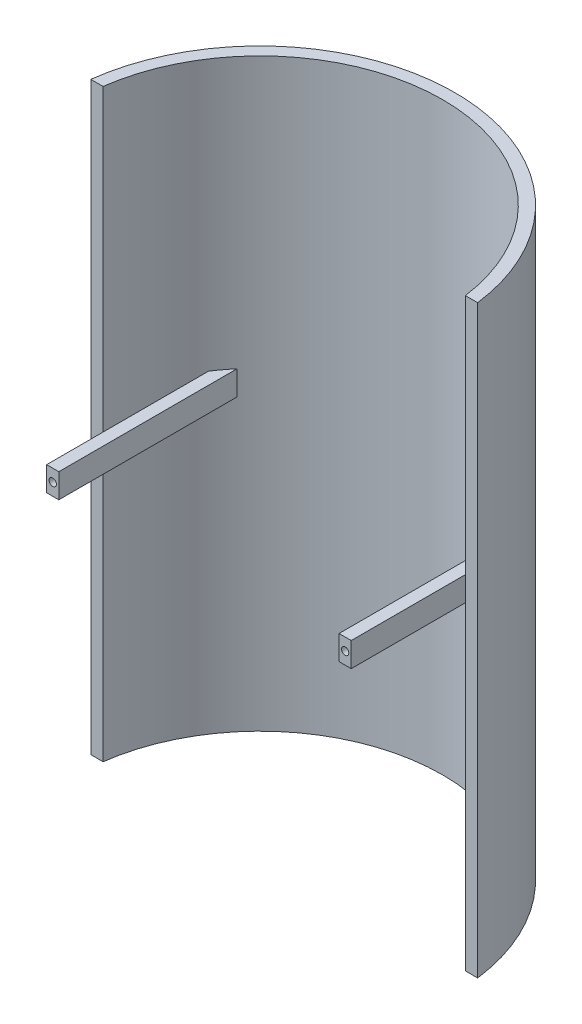
ISO-10303-21;
HEADER;
FILE_DESCRIPTION(('STEP AP214'),'2;1');
FILE_NAME('part.step','',(''),(''),'','','');
FILE_SCHEMA(('AUTOMOTIVE_DESIGN { 1 0 10303 214 1 1 1 1 }'));
ENDSEC;
DATA;
#1=APPLICATION_CONTEXT('core data for automotive mechanical design processes');
#2=APPLICATION_PROTOCOL_DEFINITION('international standard','automotive_design',2000,#1);
#3=PRODUCT_CONTEXT('',#1,'mechanical');
#4=PRODUCT('Part','Part','',(#3));
#5=PRODUCT_RELATED_PRODUCT_CATEGORY('part','',(#4));
#6=PRODUCT_DEFINITION_FORMATION('','',#4);
#7=PRODUCT_DEFINITION_CONTEXT('part definition',#1,'design');
#8=PRODUCT_DEFINITION('design','',#6,#7);
#9=PRODUCT_DEFINITION_SHAPE('','',#8);
#10=(LENGTH_UNIT() NAMED_UNIT(*) SI_UNIT(.MILLI.,.METRE.));
#11=(NAMED_UNIT(*) PLANE_ANGLE_UNIT() SI_UNIT($,.RADIAN.));
#12=(NAMED_UNIT(*) SI_UNIT($,.STERADIAN.) SOLID_ANGLE_UNIT());
#13=UNCERTAINTY_MEASURE_WITH_UNIT(LENGTH_MEASURE(1.E-05),#10,'distance_accuracy_value','');
#14=(GEOMETRIC_REPRESENTATION_CONTEXT(3) GLOBAL_UNCERTAINTY_ASSIGNED_CONTEXT((#13)) GLOBAL_UNIT_ASSIGNED_CONTEXT((#10,
#11,#12)) REPRESENTATION_CONTEXT('',''));
#15=CARTESIAN_POINT('',(0.,0.,0.));
#16=DIRECTION('',(0.,0.,1.));
#17=DIRECTION('',(1.,0.,0.));
#18=AXIS2_PLACEMENT_3D('',#15,#16,#17);
#19=CARTESIAN_POINT('',(-80.,-120.,70.));
#20=DIRECTION('',(0.,1.,0.));
#21=DIRECTION('',(0.,0.,1.));
#22=AXIS2_PLACEMENT_3D('',#19,#20,#21);
#23=PLANE('',#22);
#24=CARTESIAN_POINT('',(0.,-120.,80.));
#25=DIRECTION('',(0.,1.,0.));
#26=DIRECTION('',(0.,0.,1.));
#27=AXIS2_PLACEMENT_3D('',#24,#25,#26);
#28=CIRCLE('',#27,80.);
#29=CARTESIAN_POINT('',(79.3725393319377,-120.,70.));
#30=VERTEX_POINT('',#29);
#31=CARTESIAN_POINT('',(-79.3725393319377,-120.,70.));
#32=VERTEX_POINT('',#31);
#33=EDGE_CURVE('E279',#30,#32,#28,.T.);
#34=ORIENTED_EDGE('',*,*,#33,.F.);
#35=DIRECTION('',(1.,0.,0.));
#36=VECTOR('',#35,1.);
#37=CARTESIAN_POINT('',(-80.,-120.,70.));
#38=LINE('',#37,#36);
#39=CARTESIAN_POINT('',(74.3303437365925,-120.,70.));
#40=VERTEX_POINT('',#39);
#41=EDGE_CURVE('E282',#40,#30,#38,.T.);
#42=ORIENTED_EDGE('',*,*,#41,.F.);
#43=CARTESIAN_POINT('',(0.,-120.,80.));
#44=DIRECTION('',(0.,1.,0.));
#45=DIRECTION('',(0.,0.,1.));
#46=AXIS2_PLACEMENT_3D('',#43,#44,#45);
#47=CIRCLE('',#46,75.);
#48=CARTESIAN_POINT('',(-74.3303437365926,-120.,70.));
#49=VERTEX_POINT('',#48);
#50=EDGE_CURVE('E267',#40,#49,#47,.T.);
#51=ORIENTED_EDGE('',*,*,#50,.T.);
#52=EDGE_CURVE('E283',#32,#49,#38,.T.);
#53=ORIENTED_EDGE('',*,*,#52,.F.);
#54=EDGE_LOOP('',(#34,#42,#51,#53));
#55=FACE_BOUND('',#54,.T.);
#56=ADVANCED_FACE('F99',(#55),#23,.F.);
#57=CARTESIAN_POINT('',(-80.,120.,70.));
#58=DIRECTION('',(0.,-1.,0.));
#59=DIRECTION('',(1.,0.,0.));
#60=AXIS2_PLACEMENT_3D('',#57,#58,#59);
#61=PLANE('',#60);
#62=DIRECTION('',(-1.,0.,0.));
#63=VECTOR('',#62,1.);
#64=CARTESIAN_POINT('',(-80.,120.,70.));
#65=LINE('',#64,#63);
#66=CARTESIAN_POINT('',(79.3725393319377,120.,70.));
#67=VERTEX_POINT('',#66);
#68=CARTESIAN_POINT('',(74.3303437365925,120.,70.));
#69=VERTEX_POINT('',#68);
#70=EDGE_CURVE('E290',#67,#69,#65,.T.);
#71=ORIENTED_EDGE('',*,*,#70,.F.);
#72=CARTESIAN_POINT('',(0.,120.,80.));
#73=DIRECTION('',(0.,1.,0.));
#74=DIRECTION('',(0.,0.,1.));
#75=AXIS2_PLACEMENT_3D('',#72,#73,#74);
#76=CIRCLE('',#75,80.);
#77=CARTESIAN_POINT('',(-79.3725393319377,120.,70.));
#78=VERTEX_POINT('',#77);
#79=EDGE_CURVE('E271',#67,#78,#76,.T.);
#80=ORIENTED_EDGE('',*,*,#79,.T.);
#81=CARTESIAN_POINT('',(-74.3303437365926,120.,70.));
#82=VERTEX_POINT('',#81);
#83=EDGE_CURVE('E287',#82,#78,#65,.T.);
#84=ORIENTED_EDGE('',*,*,#83,.F.);
#85=CARTESIAN_POINT('',(0.,120.,80.));
#86=DIRECTION('',(0.,1.,0.));
#87=DIRECTION('',(0.,0.,1.));
#88=AXIS2_PLACEMENT_3D('',#85,#86,#87);
#89=CIRCLE('',#88,75.);
#90=EDGE_CURVE('E264',#69,#82,#89,.T.);
#91=ORIENTED_EDGE('',*,*,#90,.F.);
#92=EDGE_LOOP('',(#71,#80,#84,#91));
#93=FACE_BOUND('',#92,.T.);
#94=ADVANCED_FACE('F336',(#93),#61,.F.);
#95=CARTESIAN_POINT('',(-80.,-110.,70.));
#96=DIRECTION('',(0.,0.,1.));
#97=DIRECTION('',(1.,0.,0.));
#98=AXIS2_PLACEMENT_3D('',#95,#96,#97);
#99=PLANE('',#98);
#100=ORIENTED_EDGE('',*,*,#41,.T.);
#101=DIRECTION('',(0.,1.,0.));
#102=VECTOR('',#101,1.);
#103=CARTESIAN_POINT('',(79.3725393319377,-122.,70.));
#104=LINE('',#103,#102);
#105=EDGE_CURVE('E260',#30,#67,#104,.T.);
#106=ORIENTED_EDGE('',*,*,#105,.T.);
#107=ORIENTED_EDGE('',*,*,#70,.T.);
#108=DIRECTION('',(0.,1.,0.));
#109=VECTOR('',#108,1.);
#110=CARTESIAN_POINT('',(74.3303437365926,-122.,70.));
#111=LINE('',#110,#109);
#112=EDGE_CURVE('E294',#40,#69,#111,.T.);
#113=ORIENTED_EDGE('',*,*,#112,.F.);
#114=EDGE_LOOP('',(#100,#106,#107,#113));
#115=FACE_BOUND('',#114,.T.);
#116=ADVANCED_FACE('F326',(#115),#99,.T.);
#117=DIRECTION('',(0.,1.,0.));
#118=VECTOR('',#117,1.);
#119=CARTESIAN_POINT('',(-74.3303437365926,-122.,70.));
#120=LINE('',#119,#118);
#121=EDGE_CURVE('E291',#82,#49,#120,.F.);
#122=ORIENTED_EDGE('',*,*,#121,.F.);
#123=ORIENTED_EDGE('',*,*,#83,.T.);
#124=DIRECTION('',(0.,1.,0.));
#125=VECTOR('',#124,1.);
#126=CARTESIAN_POINT('',(-79.3725393319377,-122.,70.));
#127=LINE('',#126,#125);
#128=EDGE_CURVE('E275',#32,#78,#127,.T.);
#129=ORIENTED_EDGE('',*,*,#128,.F.);
#130=ORIENTED_EDGE('',*,*,#52,.T.);
#131=EDGE_LOOP('',(#122,#123,#129,#130));
#132=FACE_BOUND('',#131,.T.);
#133=ADVANCED_FACE('F342',(#132),#99,.T.);
#134=CARTESIAN_POINT('',(0.,-122.,80.));
#135=DIRECTION('',(0.,1.,0.));
#136=DIRECTION('',(0.,0.,1.));
#137=AXIS2_PLACEMENT_3D('',#134,#135,#136);
#138=CYLINDRICAL_SURFACE('',#137,80.);
#139=ORIENTED_EDGE('',*,*,#33,.T.);
#140=ORIENTED_EDGE('',*,*,#128,.T.);
#141=ORIENTED_EDGE('',*,*,#79,.F.);
#142=ORIENTED_EDGE('',*,*,#105,.F.);
#143=EDGE_LOOP('',(#139,#140,#141,#142));
#144=FACE_BOUND('',#143,.T.);
#145=ADVANCED_FACE('F333',(#144),#138,.T.);
#146=CARTESIAN_POINT('',(0.,-122.,80.));
#147=DIRECTION('',(0.,1.,0.));
#148=DIRECTION('',(0.,0.,1.));
#149=AXIS2_PLACEMENT_3D('',#146,#147,#148);
#150=CYLINDRICAL_SURFACE('',#149,75.);
#151=CARTESIAN_POINT('',(0.,-1.00000000000004,80.));
#152=DIRECTION('',(0.,-1.,0.));
#153=DIRECTION('',(0.,0.,-1.));
#154=AXIS2_PLACEMENT_3D('',#151,#152,#153);
#155=CIRCLE('',#154,75.);
#156=CARTESIAN_POINT('',(62.5,-1.00000000000004,38.5421901205575));
#157=VERTEX_POINT('',#156);
#158=CARTESIAN_POINT('',(57.5,-1.00000000000004,31.8465992893544));
#159=VERTEX_POINT('',#158);
#160=EDGE_CURVE('E107',#157,#159,#155,.F.);
#161=ORIENTED_EDGE('',*,*,#160,.T.);
#162=DIRECTION('',(0.,1.,0.));
#163=VECTOR('',#162,1.);
#164=CARTESIAN_POINT('',(57.5,-122.,31.8465992893544));
#165=LINE('',#164,#163);
#166=CARTESIAN_POINT('',(57.5,8.99999999999999,31.8465992893544));
#167=VERTEX_POINT('',#166);
#168=EDGE_CURVE('E12',#159,#167,#165,.T.);
#169=ORIENTED_EDGE('',*,*,#168,.T.);
#170=CARTESIAN_POINT('',(0.,8.99999999999998,80.));
#171=DIRECTION('',(0.,1.,0.));
#172=DIRECTION('',(0.,0.,1.));
#173=AXIS2_PLACEMENT_3D('',#170,#171,#172);
#174=CIRCLE('',#173,75.);
#175=CARTESIAN_POINT('',(62.5,8.99999999999996,38.5421901205575));
#176=VERTEX_POINT('',#175);
#177=EDGE_CURVE('E316',#167,#176,#174,.F.);
#178=ORIENTED_EDGE('',*,*,#177,.T.);
#179=DIRECTION('',(0.,1.,0.));
#180=VECTOR('',#179,1.);
#181=CARTESIAN_POINT('',(62.5,-122.,38.5421901205575));
#182=LINE('',#181,#180);
#183=EDGE_CURVE('E312',#157,#176,#182,.T.);
#184=ORIENTED_EDGE('',*,*,#183,.F.);
#185=EDGE_LOOP('',(#161,#169,#178,#184));
#186=FACE_BOUND('',#185,.T.);
#187=CARTESIAN_POINT('',(0.,8.99999999999998,80.));
#188=DIRECTION('',(0.,-1.,0.));
#189=DIRECTION('',(0.,0.,-1.));
#190=AXIS2_PLACEMENT_3D('',#187,#188,#189);
#191=CIRCLE('',#190,75.);
#192=CARTESIAN_POINT('',(-57.5,8.99999999999999,31.8465992893544));
#193=VERTEX_POINT('',#192);
#194=CARTESIAN_POINT('',(-62.5,8.99999999999995,38.5421901205574));
#195=VERTEX_POINT('',#194);
#196=EDGE_CURVE('E305',#193,#195,#191,.F.);
#197=ORIENTED_EDGE('',*,*,#196,.F.);
#198=DIRECTION('',(0.,1.,0.));
#199=VECTOR('',#198,1.);
#200=CARTESIAN_POINT('',(-57.5,-122.,31.8465992893544));
#201=LINE('',#200,#199);
#202=CARTESIAN_POINT('',(-57.5,-1.00000000000004,31.8465992893544));
#203=VERTEX_POINT('',#202);
#204=EDGE_CURVE('E309',#193,#203,#201,.F.);
#205=ORIENTED_EDGE('',*,*,#204,.T.);
#206=CARTESIAN_POINT('',(0.,-1.00000000000004,80.));
#207=DIRECTION('',(0.,1.,0.));
#208=DIRECTION('',(0.,0.,1.));
#209=AXIS2_PLACEMENT_3D('',#206,#207,#208);
#210=CIRCLE('',#209,75.);
#211=CARTESIAN_POINT('',(-62.5,-1.00000000000005,38.5421901205574));
#212=VERTEX_POINT('',#211);
#213=EDGE_CURVE('E301',#212,#203,#210,.F.);
#214=ORIENTED_EDGE('',*,*,#213,.F.);
#215=DIRECTION('',(0.,1.,0.));
#216=VECTOR('',#215,1.);
#217=CARTESIAN_POINT('',(-62.5,-122.,38.5421901205574));
#218=LINE('',#217,#216);
#219=EDGE_CURVE('E297',#195,#212,#218,.F.);
#220=ORIENTED_EDGE('',*,*,#219,.F.);
#221=EDGE_LOOP('',(#197,#205,#214,#220));
#222=FACE_BOUND('',#221,.T.);
#223=ORIENTED_EDGE('',*,*,#112,.T.);
#224=ORIENTED_EDGE('',*,*,#90,.T.);
#225=ORIENTED_EDGE('',*,*,#121,.T.);
#226=ORIENTED_EDGE('',*,*,#50,.F.);
#227=EDGE_LOOP('',(#223,#224,#225,#226));
#228=FACE_BOUND('',#227,.T.);
#229=ADVANCED_FACE('F340',(#186,#222,#228),#150,.F.);
#230=CARTESIAN_POINT('',(-57.5,8.99999999999995,105.));
#231=DIRECTION('',(0.,0.,-1.));
#232=DIRECTION('',(-1.,0.,0.));
#233=AXIS2_PLACEMENT_3D('',#230,#231,#232);
#234=PLANE('',#233);
#235=CARTESIAN_POINT('',(-60.,3.99999999999996,105.));
#236=DIRECTION('',(0.,0.,1.));
#237=DIRECTION('',(1.,0.,0.));
#238=AXIS2_PLACEMENT_3D('',#235,#236,#237);
#239=CIRCLE('',#238,1.5);
#240=CARTESIAN_POINT('',(-58.5,3.99999999999996,105.));
#241=VERTEX_POINT('',#240);
#242=EDGE_CURVE('E194',#241,#241,#239,.T.);
#243=ORIENTED_EDGE('',*,*,#242,.F.);
#244=EDGE_LOOP('',(#243));
#245=FACE_BOUND('',#244,.T.);
#246=DIRECTION('',(0.,-1.,0.));
#247=VECTOR('',#246,1.);
#248=CARTESIAN_POINT('',(-62.5,8.99999999999995,105.));
#249=LINE('',#248,#247);
#250=CARTESIAN_POINT('',(-62.5,8.99999999999995,105.));
#251=VERTEX_POINT('',#250);
#252=CARTESIAN_POINT('',(-62.5,-1.00000000000005,105.));
#253=VERTEX_POINT('',#252);
#254=EDGE_CURVE('E247',#251,#253,#249,.T.);
#255=ORIENTED_EDGE('',*,*,#254,.T.);
#256=DIRECTION('',(-1.,0.,0.));
#257=VECTOR('',#256,1.);
#258=CARTESIAN_POINT('',(-57.5,-1.00000000000005,105.));
#259=LINE('',#258,#257);
#260=CARTESIAN_POINT('',(-57.5,-1.00000000000005,105.));
#261=VERTEX_POINT('',#260);
#262=EDGE_CURVE('E244',#261,#253,#259,.T.);
#263=ORIENTED_EDGE('',*,*,#262,.F.);
#264=DIRECTION('',(0.,-1.,0.));
#265=VECTOR('',#264,1.);
#266=CARTESIAN_POINT('',(-57.5,8.99999999999995,105.));
#267=LINE('',#266,#265);
#268=CARTESIAN_POINT('',(-57.5,8.99999999999995,105.));
#269=VERTEX_POINT('',#268);
#270=EDGE_CURVE('E236',#269,#261,#267,.T.);
#271=ORIENTED_EDGE('',*,*,#270,.F.);
#272=DIRECTION('',(-1.,0.,0.));
#273=VECTOR('',#272,1.);
#274=CARTESIAN_POINT('',(-57.5,8.99999999999995,105.));
#275=LINE('',#274,#273);
#276=EDGE_CURVE('E256',#269,#251,#275,.T.);
#277=ORIENTED_EDGE('',*,*,#276,.T.);
#278=EDGE_LOOP('',(#255,#263,#271,#277));
#279=FACE_BOUND('',#278,.T.);
#280=ADVANCED_FACE('F375',(#245,#279),#234,.F.);
#281=CARTESIAN_POINT('',(-57.5,0.,0.));
#282=DIRECTION('',(1.,0.,0.));
#283=DIRECTION('',(0.,0.,-1.));
#284=AXIS2_PLACEMENT_3D('',#281,#282,#283);
#285=PLANE('',#284);
#286=ORIENTED_EDGE('',*,*,#204,.F.);
#287=DIRECTION('',(0.,0.,1.));
#288=VECTOR('',#287,1.);
#289=CARTESIAN_POINT('',(-57.5,8.99999999999997,5.));
#290=LINE('',#289,#288);
#291=EDGE_CURVE('E233',#193,#269,#290,.T.);
#292=ORIENTED_EDGE('',*,*,#291,.T.);
#293=ORIENTED_EDGE('',*,*,#270,.T.);
#294=DIRECTION('',(0.,0.,-1.));
#295=VECTOR('',#294,1.);
#296=CARTESIAN_POINT('',(-57.5,-1.00000000000005,105.));
#297=LINE('',#296,#295);
#298=EDGE_CURVE('E240',#261,#203,#297,.T.);
#299=ORIENTED_EDGE('',*,*,#298,.T.);
#300=EDGE_LOOP('',(#286,#292,#293,#299));
#301=FACE_BOUND('',#300,.T.);
#302=ADVANCED_FACE('F369',(#301),#285,.T.);
#303=CARTESIAN_POINT('',(-62.5,0.,0.));
#304=DIRECTION('',(1.,0.,0.));
#305=DIRECTION('',(0.,0.,-1.));
#306=AXIS2_PLACEMENT_3D('',#303,#304,#305);
#307=PLANE('',#306);
#308=DIRECTION('',(0.,0.,1.));
#309=VECTOR('',#308,1.);
#310=CARTESIAN_POINT('',(-62.5,8.99999999999997,5.));
#311=LINE('',#310,#309);
#312=EDGE_CURVE('E229',#195,#251,#311,.T.);
#313=ORIENTED_EDGE('',*,*,#312,.F.);
#314=ORIENTED_EDGE('',*,*,#219,.T.);
#315=DIRECTION('',(0.,0.,-1.));
#316=VECTOR('',#315,1.);
#317=CARTESIAN_POINT('',(-62.5,-1.00000000000005,105.));
#318=LINE('',#317,#316);
#319=EDGE_CURVE('E237',#253,#212,#318,.T.);
#320=ORIENTED_EDGE('',*,*,#319,.F.);
#321=ORIENTED_EDGE('',*,*,#254,.F.);
#322=EDGE_LOOP('',(#313,#314,#320,#321));
#323=FACE_BOUND('',#322,.T.);
#324=ADVANCED_FACE('F374',(#323),#307,.F.);
#325=CARTESIAN_POINT('',(-57.5,-1.00000000000005,105.));
#326=DIRECTION('',(0.,1.,0.));
#327=DIRECTION('',(0.,0.,1.));
#328=AXIS2_PLACEMENT_3D('',#325,#326,#327);
#329=PLANE('',#328);
#330=ORIENTED_EDGE('',*,*,#319,.T.);
#331=ORIENTED_EDGE('',*,*,#213,.T.);
#332=ORIENTED_EDGE('',*,*,#298,.F.);
#333=ORIENTED_EDGE('',*,*,#262,.T.);
#334=EDGE_LOOP('',(#330,#331,#332,#333));
#335=FACE_BOUND('',#334,.T.);
#336=ADVANCED_FACE('F387',(#335),#329,.F.);
#337=CARTESIAN_POINT('',(-57.5,8.99999999999997,5.));
#338=DIRECTION('',(0.,-1.,0.));
#339=DIRECTION('',(0.,0.,-1.));
#340=AXIS2_PLACEMENT_3D('',#337,#338,#339);
#341=PLANE('',#340);
#342=ORIENTED_EDGE('',*,*,#291,.F.);
#343=ORIENTED_EDGE('',*,*,#196,.T.);
#344=ORIENTED_EDGE('',*,*,#312,.T.);
#345=ORIENTED_EDGE('',*,*,#276,.F.);
#346=EDGE_LOOP('',(#342,#343,#344,#345));
#347=FACE_BOUND('',#346,.T.);
#348=ADVANCED_FACE('F397',(#347),#341,.F.);
#349=CARTESIAN_POINT('',(-60.,3.99999999999996,78.));
#350=DIRECTION('',(0.,0.,1.));
#351=DIRECTION('',(1.,0.,0.));
#352=AXIS2_PLACEMENT_3D('',#349,#350,#351);
#353=CYLINDRICAL_SURFACE('',#352,1.5);
#354=CARTESIAN_POINT('',(-60.,3.99999999999996,78.));
#355=DIRECTION('',(0.,0.,1.));
#356=DIRECTION('',(1.,0.,0.));
#357=AXIS2_PLACEMENT_3D('',#354,#355,#356);
#358=CIRCLE('',#357,1.5);
#359=CARTESIAN_POINT('',(-58.5,3.99999999999996,78.));
#360=VERTEX_POINT('',#359);
#361=EDGE_CURVE('E225',#360,#360,#358,.T.);
#362=ORIENTED_EDGE('',*,*,#361,.F.);
#363=EDGE_LOOP('',(#362));
#364=FACE_BOUND('',#363,.T.);
#365=ORIENTED_EDGE('',*,*,#242,.T.);
#366=EDGE_LOOP('',(#365));
#367=FACE_BOUND('',#366,.T.);
#368=ADVANCED_FACE('F407',(#364,#367),#353,.F.);
#369=CARTESIAN_POINT('',(-60.,3.99999999999996,78.));
#370=DIRECTION('',(0.,0.,1.));
#371=DIRECTION('',(1.,0.,0.));
#372=AXIS2_PLACEMENT_3D('',#369,#370,#371);
#373=PLANE('',#372);
#374=ORIENTED_EDGE('',*,*,#361,.T.);
#375=EDGE_LOOP('',(#374));
#376=FACE_BOUND('',#375,.T.);
#377=ADVANCED_FACE('F427',(#376),#373,.T.);
#378=CARTESIAN_POINT('',(57.5,8.99999999999995,105.));
#379=DIRECTION('',(0.,0.,1.));
#380=DIRECTION('',(1.,0.,0.));
#381=AXIS2_PLACEMENT_3D('',#378,#379,#380);
#382=PLANE('',#381);
#383=CARTESIAN_POINT('',(60.,3.99999999999996,105.));
#384=DIRECTION('',(0.,0.,-1.));
#385=DIRECTION('',(-1.,0.,0.));
#386=AXIS2_PLACEMENT_3D('',#383,#384,#385);
#387=CIRCLE('',#386,1.5);
#388=CARTESIAN_POINT('',(58.5,3.99999999999996,105.));
#389=VERTEX_POINT('',#388);
#390=EDGE_CURVE('E522',#389,#389,#387,.T.);
#391=ORIENTED_EDGE('',*,*,#390,.T.);
#392=EDGE_LOOP('',(#391));
#393=FACE_BOUND('',#392,.T.);
#394=DIRECTION('',(0.,-1.,0.));
#395=VECTOR('',#394,1.);
#396=CARTESIAN_POINT('',(62.5,8.99999999999995,105.));
#397=LINE('',#396,#395);
#398=CARTESIAN_POINT('',(62.5,8.99999999999995,105.));
#399=VERTEX_POINT('',#398);
#400=CARTESIAN_POINT('',(62.5,-1.00000000000005,105.));
#401=VERTEX_POINT('',#400);
#402=EDGE_CURVE('E217',#399,#401,#397,.T.);
#403=ORIENTED_EDGE('',*,*,#402,.F.);
#404=DIRECTION('',(1.,0.,0.));
#405=VECTOR('',#404,1.);
#406=CARTESIAN_POINT('',(57.5,8.99999999999995,105.));
#407=LINE('',#406,#405);
#408=CARTESIAN_POINT('',(57.5,8.99999999999995,105.));
#409=VERTEX_POINT('',#408);
#410=EDGE_CURVE('E195',#409,#399,#407,.T.);
#411=ORIENTED_EDGE('',*,*,#410,.F.);
#412=DIRECTION('',(0.,-1.,0.));
#413=VECTOR('',#412,1.);
#414=CARTESIAN_POINT('',(57.5,8.99999999999995,105.));
#415=LINE('',#414,#413);
#416=CARTESIAN_POINT('',(57.5,-1.00000000000005,105.));
#417=VERTEX_POINT('',#416);
#418=EDGE_CURVE('E201',#409,#417,#415,.T.);
#419=ORIENTED_EDGE('',*,*,#418,.T.);
#420=DIRECTION('',(1.,0.,0.));
#421=VECTOR('',#420,1.);
#422=CARTESIAN_POINT('',(57.5,-1.00000000000005,105.));
#423=LINE('',#422,#421);
#424=EDGE_CURVE('E183',#417,#401,#423,.T.);
#425=ORIENTED_EDGE('',*,*,#424,.T.);
#426=EDGE_LOOP('',(#403,#411,#419,#425));
#427=FACE_BOUND('',#426,.T.);
#428=ADVANCED_FACE('F206',(#393,#427),#382,.T.);
#429=CARTESIAN_POINT('',(62.5,0.,0.));
#430=DIRECTION('',(-1.,0.,0.));
#431=DIRECTION('',(0.,0.,-1.));
#432=AXIS2_PLACEMENT_3D('',#429,#430,#431);
#433=PLANE('',#432);
#434=DIRECTION('',(0.,0.,-1.));
#435=VECTOR('',#434,1.);
#436=CARTESIAN_POINT('',(62.5,-1.00000000000005,105.));
#437=LINE('',#436,#435);
#438=EDGE_CURVE('E188',#401,#157,#437,.T.);
#439=ORIENTED_EDGE('',*,*,#438,.T.);
#440=ORIENTED_EDGE('',*,*,#183,.T.);
#441=DIRECTION('',(0.,0.,1.));
#442=VECTOR('',#441,1.);
#443=CARTESIAN_POINT('',(62.5,8.99999999999997,5.));
#444=LINE('',#443,#442);
#445=EDGE_CURVE('E203',#176,#399,#444,.T.);
#446=ORIENTED_EDGE('',*,*,#445,.T.);
#447=ORIENTED_EDGE('',*,*,#402,.T.);
#448=EDGE_LOOP('',(#439,#440,#446,#447));
#449=FACE_BOUND('',#448,.T.);
#450=ADVANCED_FACE('F461',(#449),#433,.F.);
#451=CARTESIAN_POINT('',(57.5,0.,0.));
#452=DIRECTION('',(-1.,0.,0.));
#453=DIRECTION('',(0.,0.,-1.));
#454=AXIS2_PLACEMENT_3D('',#451,#452,#453);
#455=PLANE('',#454);
#456=ORIENTED_EDGE('',*,*,#168,.F.);
#457=DIRECTION('',(0.,0.,-1.));
#458=VECTOR('',#457,1.);
#459=CARTESIAN_POINT('',(57.5,-1.00000000000005,105.));
#460=LINE('',#459,#458);
#461=EDGE_CURVE('E186',#417,#159,#460,.T.);
#462=ORIENTED_EDGE('',*,*,#461,.F.);
#463=ORIENTED_EDGE('',*,*,#418,.F.);
#464=DIRECTION('',(0.,0.,1.));
#465=VECTOR('',#464,1.);
#466=CARTESIAN_POINT('',(57.5,8.99999999999997,5.));
#467=LINE('',#466,#465);
#468=EDGE_CURVE('E209',#167,#409,#467,.T.);
#469=ORIENTED_EDGE('',*,*,#468,.F.);
#470=EDGE_LOOP('',(#456,#462,#463,#469));
#471=FACE_BOUND('',#470,.T.);
#472=ADVANCED_FACE('F199',(#471),#455,.T.);
#473=CARTESIAN_POINT('',(57.5,8.99999999999997,5.));
#474=DIRECTION('',(0.,1.,0.));
#475=DIRECTION('',(0.,0.,1.));
#476=AXIS2_PLACEMENT_3D('',#473,#474,#475);
#477=PLANE('',#476);
#478=ORIENTED_EDGE('',*,*,#177,.F.);
#479=ORIENTED_EDGE('',*,*,#468,.T.);
#480=ORIENTED_EDGE('',*,*,#410,.T.);
#481=ORIENTED_EDGE('',*,*,#445,.F.);
#482=EDGE_LOOP('',(#478,#479,#480,#481));
#483=FACE_BOUND('',#482,.T.);
#484=ADVANCED_FACE('F480',(#483),#477,.T.);
#485=CARTESIAN_POINT('',(57.5,-1.00000000000005,105.));
#486=DIRECTION('',(0.,-1.,0.));
#487=DIRECTION('',(0.,0.,-1.));
#488=AXIS2_PLACEMENT_3D('',#485,#486,#487);
#489=PLANE('',#488);
#490=ORIENTED_EDGE('',*,*,#160,.F.);
#491=ORIENTED_EDGE('',*,*,#438,.F.);
#492=ORIENTED_EDGE('',*,*,#424,.F.);
#493=ORIENTED_EDGE('',*,*,#461,.T.);
#494=EDGE_LOOP('',(#490,#491,#492,#493));
#495=FACE_BOUND('',#494,.T.);
#496=ADVANCED_FACE('F185',(#495),#489,.T.);
#497=CARTESIAN_POINT('',(60.,3.99999999999996,78.));
#498=DIRECTION('',(0.,0.,1.));
#499=DIRECTION('',(1.,0.,0.));
#500=AXIS2_PLACEMENT_3D('',#497,#498,#499);
#501=CYLINDRICAL_SURFACE('',#500,1.5);
#502=CARTESIAN_POINT('',(60.,3.99999999999996,78.));
#503=DIRECTION('',(0.,0.,-1.));
#504=DIRECTION('',(-1.,0.,0.));
#505=AXIS2_PLACEMENT_3D('',#502,#503,#504);
#506=CIRCLE('',#505,1.5);
#507=CARTESIAN_POINT('',(58.5,3.99999999999996,78.));
#508=VERTEX_POINT('',#507);
#509=EDGE_CURVE('E218',#508,#508,#506,.T.);
#510=ORIENTED_EDGE('',*,*,#509,.T.);
#511=EDGE_LOOP('',(#510));
#512=FACE_BOUND('',#511,.T.);
#513=ORIENTED_EDGE('',*,*,#390,.F.);
#514=EDGE_LOOP('',(#513));
#515=FACE_BOUND('',#514,.T.);
#516=ADVANCED_FACE('F497',(#512,#515),#501,.F.);
#517=CARTESIAN_POINT('',(60.,3.99999999999996,78.));
#518=DIRECTION('',(0.,0.,1.));
#519=DIRECTION('',(-1.,0.,0.));
#520=AXIS2_PLACEMENT_3D('',#517,#518,#519);
#521=PLANE('',#520);
#522=ORIENTED_EDGE('',*,*,#509,.F.);
#523=EDGE_LOOP('',(#522));
#524=FACE_BOUND('',#523,.T.);
#525=ADVANCED_FACE('F505',(#524),#521,.T.);
#526=CLOSED_SHELL('',(#56,#94,#116,#133,#145,#229,#280,#302,#324,#336,#348,#368,#377,#428,#450,
#472,#484,#496,#516,#525));
#527=MANIFOLD_SOLID_BREP('B2',#526);
#528=ADVANCED_BREP_SHAPE_REPRESENTATION('',(#18,#527),#14);
#529=SHAPE_DEFINITION_REPRESENTATION(#9,#528);
ENDSEC;
END-ISO-10303-21;
